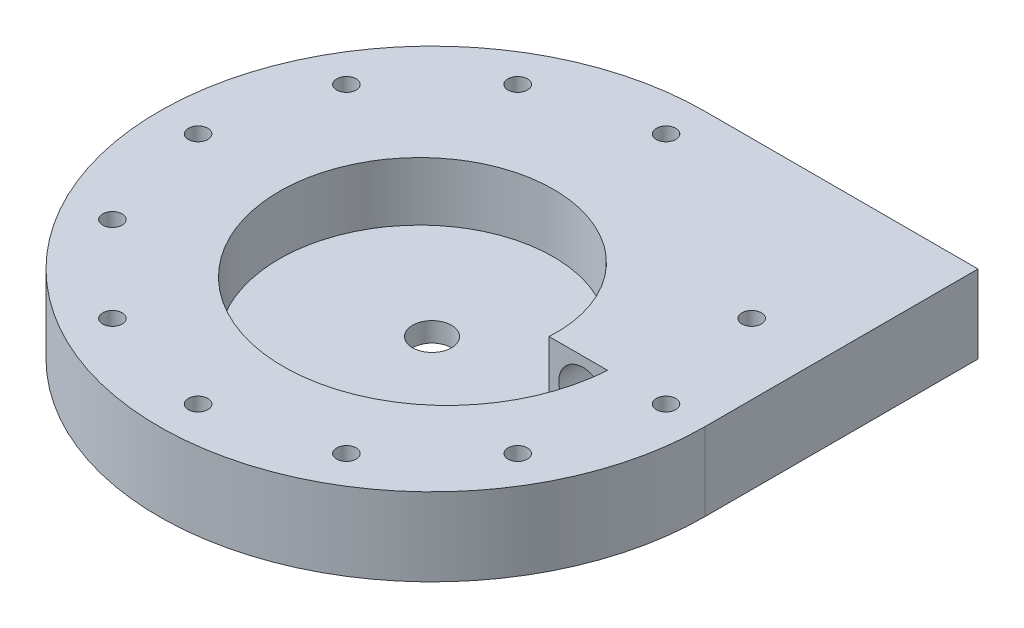
ISO-10303-21;
HEADER;
FILE_DESCRIPTION(('STEP AP214'),'2;1');
FILE_NAME('part.step','',(''),(''),'','','');
FILE_SCHEMA(('AUTOMOTIVE_DESIGN { 1 0 10303 214 1 1 1 1 }'));
ENDSEC;
DATA;
#1=APPLICATION_CONTEXT('core data for automotive mechanical design processes');
#2=APPLICATION_PROTOCOL_DEFINITION('international standard','automotive_design',2000,#1);
#3=PRODUCT_CONTEXT('',#1,'mechanical');
#4=PRODUCT('Part','Part','',(#3));
#5=PRODUCT_RELATED_PRODUCT_CATEGORY('part','',(#4));
#6=PRODUCT_DEFINITION_FORMATION('','',#4);
#7=PRODUCT_DEFINITION_CONTEXT('part definition',#1,'design');
#8=PRODUCT_DEFINITION('design','',#6,#7);
#9=PRODUCT_DEFINITION_SHAPE('','',#8);
#10=(LENGTH_UNIT() NAMED_UNIT(*) SI_UNIT(.MILLI.,.METRE.));
#11=(NAMED_UNIT(*) PLANE_ANGLE_UNIT() SI_UNIT($,.RADIAN.));
#12=(NAMED_UNIT(*) SI_UNIT($,.STERADIAN.) SOLID_ANGLE_UNIT());
#13=UNCERTAINTY_MEASURE_WITH_UNIT(LENGTH_MEASURE(1.E-05),#10,'distance_accuracy_value','');
#14=(GEOMETRIC_REPRESENTATION_CONTEXT(3) GLOBAL_UNCERTAINTY_ASSIGNED_CONTEXT((#13)) GLOBAL_UNIT_ASSIGNED_CONTEXT((#10,
#11,#12)) REPRESENTATION_CONTEXT('',''));
#15=CARTESIAN_POINT('',(0.,0.,0.));
#16=DIRECTION('',(0.,0.,1.));
#17=DIRECTION('',(1.,0.,0.));
#18=AXIS2_PLACEMENT_3D('',#15,#16,#17);
#19=CARTESIAN_POINT('',(0.,-19.05,0.));
#20=DIRECTION('',(0.,0.,1.));
#21=DIRECTION('',(1.,0.,0.));
#22=AXIS2_PLACEMENT_3D('',#19,#20,#21);
#23=PLANE('',#22);
#24=CARTESIAN_POINT('',(49.2124999999999,-11.1125,0.));
#25=DIRECTION('',(0.,0.,1.));
#26=DIRECTION('',(1.,0.,0.));
#27=AXIS2_PLACEMENT_3D('',#24,#25,#26);
#28=CIRCLE('',#27,7.9375);
#29=CARTESIAN_POINT('',(57.1499999999999,-11.1125,0.));
#30=VERTEX_POINT('',#29);
#31=CARTESIAN_POINT('',(49.2124999999999,-19.05,9.43493316167152E-13));
#32=VERTEX_POINT('',#31);
#33=EDGE_CURVE('E51',#30,#32,#28,.T.);
#34=ORIENTED_EDGE('',*,*,#33,.F.);
#35=DIRECTION('',(0.,1.,0.));
#36=VECTOR('',#35,1.);
#37=CARTESIAN_POINT('',(57.1499999999999,-19.05,1.09566965748443E-12));
#38=LINE('',#37,#36);
#39=CARTESIAN_POINT('',(57.1499999999999,0.,1.09566965748443E-12));
#40=VERTEX_POINT('',#39);
#41=EDGE_CURVE('E95',#30,#40,#38,.T.);
#42=ORIENTED_EDGE('',*,*,#41,.T.);
#43=DIRECTION('',(1.,0.,0.));
#44=VECTOR('',#43,1.);
#45=CARTESIAN_POINT('',(0.,0.,0.));
#46=LINE('',#45,#44);
#47=CARTESIAN_POINT('',(38.1,0.,0.));
#48=VERTEX_POINT('',#47);
#49=EDGE_CURVE('E59',#48,#40,#46,.T.);
#50=ORIENTED_EDGE('',*,*,#49,.F.);
#51=DIRECTION('',(0.,1.,0.));
#52=VECTOR('',#51,1.);
#53=CARTESIAN_POINT('',(38.1,-19.05,7.30446438322957E-13));
#54=LINE('',#53,#52);
#55=CARTESIAN_POINT('',(38.1,-19.05,7.30446438322957E-13));
#56=VERTEX_POINT('',#55);
#57=EDGE_CURVE('E108',#56,#48,#54,.T.);
#58=ORIENTED_EDGE('',*,*,#57,.F.);
#59=DIRECTION('',(1.,0.,0.));
#60=VECTOR('',#59,1.);
#61=CARTESIAN_POINT('',(0.,-19.05,0.));
#62=LINE('',#61,#60);
#63=EDGE_CURVE('E98',#56,#32,#62,.T.);
#64=ORIENTED_EDGE('',*,*,#63,.T.);
#65=EDGE_LOOP('',(#34,#42,#50,#58,#64));
#66=FACE_BOUND('',#65,.T.);
#67=ADVANCED_FACE('F35',(#66),#23,.T.);
#68=CARTESIAN_POINT('',(0.,-25.4,0.));
#69=DIRECTION('',(0.,1.,0.));
#70=DIRECTION('',(0.,0.,1.));
#71=AXIS2_PLACEMENT_3D('',#68,#69,#70);
#72=CYLINDRICAL_SURFACE('',#71,6.35);
#73=CARTESIAN_POINT('',(0.,-25.4,0.));
#74=DIRECTION('',(0.,1.,0.));
#75=DIRECTION('',(0.,0.,1.));
#76=AXIS2_PLACEMENT_3D('',#73,#74,#75);
#77=CIRCLE('',#76,6.35);
#78=CARTESIAN_POINT('',(0.,-25.4,6.35));
#79=VERTEX_POINT('',#78);
#80=EDGE_CURVE('E123',#79,#79,#77,.T.);
#81=ORIENTED_EDGE('',*,*,#80,.F.);
#82=EDGE_LOOP('',(#81));
#83=FACE_BOUND('',#82,.T.);
#84=CARTESIAN_POINT('',(0.,-19.05,0.));
#85=DIRECTION('',(0.,1.,0.));
#86=DIRECTION('',(0.,0.,1.));
#87=AXIS2_PLACEMENT_3D('',#84,#85,#86);
#88=CIRCLE('',#87,6.35);
#89=CARTESIAN_POINT('',(0.,-19.05,6.35));
#90=VERTEX_POINT('',#89);
#91=EDGE_CURVE('E170',#90,#90,#88,.T.);
#92=ORIENTED_EDGE('',*,*,#91,.T.);
#93=EDGE_LOOP('',(#92));
#94=FACE_BOUND('',#93,.T.);
#95=ADVANCED_FACE('F37',(#83,#94),#72,.F.);
#96=CARTESIAN_POINT('',(0.,0.,0.));
#97=DIRECTION('',(0.,1.,0.));
#98=DIRECTION('',(0.,0.,1.));
#99=AXIS2_PLACEMENT_3D('',#96,#97,#98);
#100=PLANE('',#99);
#101=CARTESIAN_POINT('',(65.9911357683747,0.,38.0999999999992));
#102=DIRECTION('',(0.,1.,0.));
#103=DIRECTION('',(0.,0.,1.));
#104=AXIS2_PLACEMENT_3D('',#101,#102,#103);
#105=CIRCLE('',#104,3.175);
#106=CARTESIAN_POINT('',(65.9911357683747,0.,41.2749999999992));
#107=VERTEX_POINT('',#106);
#108=EDGE_CURVE('E278',#107,#107,#105,.T.);
#109=ORIENTED_EDGE('',*,*,#108,.F.);
#110=EDGE_LOOP('',(#109));
#111=FACE_BOUND('',#110,.T.);
#112=CARTESIAN_POINT('',(38.1000000000008,0.,65.9911357683738));
#113=DIRECTION('',(0.,1.,0.));
#114=DIRECTION('',(0.,0.,1.));
#115=AXIS2_PLACEMENT_3D('',#112,#113,#114);
#116=CIRCLE('',#115,3.17499999999999);
#117=CARTESIAN_POINT('',(38.1000000000008,0.,69.1661357683738));
#118=VERTEX_POINT('',#117);
#119=EDGE_CURVE('E281',#118,#118,#116,.T.);
#120=ORIENTED_EDGE('',*,*,#119,.F.);
#121=EDGE_LOOP('',(#120));
#122=FACE_BOUND('',#121,.T.);
#123=CARTESIAN_POINT('',(7.9815263405954E-13,0.,76.2));
#124=DIRECTION('',(0.,1.,0.));
#125=DIRECTION('',(0.,0.,1.));
#126=AXIS2_PLACEMENT_3D('',#123,#124,#125);
#127=CIRCLE('',#126,3.17499999999999);
#128=CARTESIAN_POINT('',(7.9815263405954E-13,0.,79.375));
#129=VERTEX_POINT('',#128);
#130=EDGE_CURVE('E289',#129,#129,#127,.T.);
#131=ORIENTED_EDGE('',*,*,#130,.F.);
#132=EDGE_LOOP('',(#131));
#133=FACE_BOUND('',#132,.T.);
#134=CARTESIAN_POINT('',(-38.0999999999994,0.,65.9911357683746));
#135=DIRECTION('',(0.,1.,0.));
#136=DIRECTION('',(0.,0.,1.));
#137=AXIS2_PLACEMENT_3D('',#134,#135,#136);
#138=CIRCLE('',#137,3.17499999999999);
#139=CARTESIAN_POINT('',(-38.0999999999994,0.,69.1661357683746));
#140=VERTEX_POINT('',#139);
#141=EDGE_CURVE('E295',#140,#140,#138,.T.);
#142=ORIENTED_EDGE('',*,*,#141,.F.);
#143=EDGE_LOOP('',(#142));
#144=FACE_BOUND('',#143,.T.);
#145=CARTESIAN_POINT('',(-65.9911357683739,0.,38.1000000000005));
#146=DIRECTION('',(0.,1.,0.));
#147=DIRECTION('',(0.,0.,1.));
#148=AXIS2_PLACEMENT_3D('',#145,#146,#147);
#149=CIRCLE('',#148,3.17499999999998);
#150=CARTESIAN_POINT('',(-65.9911357683739,0.,41.2750000000005));
#151=VERTEX_POINT('',#150);
#152=EDGE_CURVE('E301',#151,#151,#149,.T.);
#153=ORIENTED_EDGE('',*,*,#152,.F.);
#154=EDGE_LOOP('',(#153));
#155=FACE_BOUND('',#154,.T.);
#156=CARTESIAN_POINT('',(-76.2,0.,0.));
#157=DIRECTION('',(0.,1.,0.));
#158=DIRECTION('',(0.,0.,1.));
#159=AXIS2_PLACEMENT_3D('',#156,#157,#158);
#160=CIRCLE('',#159,3.175);
#161=CARTESIAN_POINT('',(-76.2,0.,3.175));
#162=VERTEX_POINT('',#161);
#163=EDGE_CURVE('E307',#162,#162,#160,.T.);
#164=ORIENTED_EDGE('',*,*,#163,.F.);
#165=EDGE_LOOP('',(#164));
#166=FACE_BOUND('',#165,.T.);
#167=CARTESIAN_POINT('',(-65.9911357683744,0.,-38.0999999999996));
#168=DIRECTION('',(0.,1.,0.));
#169=DIRECTION('',(0.,0.,1.));
#170=AXIS2_PLACEMENT_3D('',#167,#168,#169);
#171=CIRCLE('',#170,3.17499999999998);
#172=CARTESIAN_POINT('',(-65.9911357683744,0.,-34.9249999999996));
#173=VERTEX_POINT('',#172);
#174=EDGE_CURVE('E313',#173,#173,#171,.T.);
#175=ORIENTED_EDGE('',*,*,#174,.F.);
#176=EDGE_LOOP('',(#175));
#177=FACE_BOUND('',#176,.T.);
#178=CARTESIAN_POINT('',(-38.1000000000003,0.,-65.9911357683741));
#179=DIRECTION('',(0.,1.,0.));
#180=DIRECTION('',(0.,0.,1.));
#181=AXIS2_PLACEMENT_3D('',#178,#179,#180);
#182=CIRCLE('',#181,3.17499999999999);
#183=CARTESIAN_POINT('',(-38.1000000000003,0.,-62.8161357683741));
#184=VERTEX_POINT('',#183);
#185=EDGE_CURVE('E160',#184,#184,#182,.T.);
#186=ORIENTED_EDGE('',*,*,#185,.F.);
#187=EDGE_LOOP('',(#186));
#188=FACE_BOUND('',#187,.T.);
#189=CARTESIAN_POINT('',(-2.66050878019847E-13,0.,-76.2));
#190=DIRECTION('',(0.,1.,0.));
#191=DIRECTION('',(0.,0.,1.));
#192=AXIS2_PLACEMENT_3D('',#189,#190,#191);
#193=CIRCLE('',#192,3.17499999999999);
#194=CARTESIAN_POINT('',(-2.66050878019847E-13,0.,-73.025));
#195=VERTEX_POINT('',#194);
#196=EDGE_CURVE('E148',#195,#195,#193,.T.);
#197=ORIENTED_EDGE('',*,*,#196,.F.);
#198=EDGE_LOOP('',(#197));
#199=FACE_BOUND('',#198,.T.);
#200=CARTESIAN_POINT('',(65.9911357683742,0.,-38.1000000000001));
#201=DIRECTION('',(0.,1.,0.));
#202=DIRECTION('',(0.,0.,1.));
#203=AXIS2_PLACEMENT_3D('',#200,#201,#202);
#204=CIRCLE('',#203,3.17499999999998);
#205=CARTESIAN_POINT('',(65.9911357683742,0.,-34.9250000000001));
#206=VERTEX_POINT('',#205);
#207=EDGE_CURVE('E147',#206,#206,#204,.T.);
#208=ORIENTED_EDGE('',*,*,#207,.F.);
#209=EDGE_LOOP('',(#208));
#210=FACE_BOUND('',#209,.T.);
#211=CARTESIAN_POINT('',(76.2,0.,0.));
#212=DIRECTION('',(0.,1.,0.));
#213=DIRECTION('',(0.,0.,1.));
#214=AXIS2_PLACEMENT_3D('',#211,#212,#213);
#215=CIRCLE('',#214,3.175);
#216=CARTESIAN_POINT('',(76.2,0.,3.175));
#217=VERTEX_POINT('',#216);
#218=EDGE_CURVE('E144',#217,#217,#215,.T.);
#219=ORIENTED_EDGE('',*,*,#218,.F.);
#220=EDGE_LOOP('',(#219));
#221=FACE_BOUND('',#220,.T.);
#222=CARTESIAN_POINT('',(0.,0.,0.));
#223=DIRECTION('',(0.,1.,0.));
#224=DIRECTION('',(0.,0.,1.));
#225=AXIS2_PLACEMENT_3D('',#222,#223,#224);
#226=CIRCLE('',#225,88.9);
#227=CARTESIAN_POINT('',(0.,0.,-88.9));
#228=VERTEX_POINT('',#227);
#229=CARTESIAN_POINT('',(88.9,0.,0.));
#230=VERTEX_POINT('',#229);
#231=EDGE_CURVE('E112',#228,#230,#226,.T.);
#232=ORIENTED_EDGE('',*,*,#231,.T.);
#233=DIRECTION('',(0.,0.,-1.));
#234=VECTOR('',#233,1.);
#235=CARTESIAN_POINT('',(88.9,0.,0.));
#236=LINE('',#235,#234);
#237=CARTESIAN_POINT('',(88.9,0.,-88.9));
#238=VERTEX_POINT('',#237);
#239=EDGE_CURVE('E114',#230,#238,#236,.T.);
#240=ORIENTED_EDGE('',*,*,#239,.T.);
#241=DIRECTION('',(-1.,0.,0.));
#242=VECTOR('',#241,1.);
#243=CARTESIAN_POINT('',(0.,0.,-88.9));
#244=LINE('',#243,#242);
#245=EDGE_CURVE('E127',#238,#228,#244,.T.);
#246=ORIENTED_EDGE('',*,*,#245,.T.);
#247=EDGE_LOOP('',(#232,#240,#246));
#248=FACE_BOUND('',#247,.T.);
#249=CARTESIAN_POINT('',(38.1,0.,0.));
#250=CARTESIAN_POINT('',(38.1041965674543,0.,-0.0650310234893211));
#251=CARTESIAN_POINT('',(38.112207842471,0.,-0.195583217435711));
#252=CARTESIAN_POINT('',(38.1261766637755,0.,-0.440876384041466));
#253=CARTESIAN_POINT('',(38.142557672689,0.,-0.771571841551634));
#254=CARTESIAN_POINT('',(38.15799051834,0.,-1.15477204735172));
#255=CARTESIAN_POINT('',(38.1712359970766,0.,-1.60960717939055));
#256=CARTESIAN_POINT('',(38.1802251596149,0.,-2.15183656026326));
#257=CARTESIAN_POINT('',(38.1801903178959,0.,-2.76477532971207));
#258=CARTESIAN_POINT('',(38.1680412903283,0.,-3.53419681611184));
#259=CARTESIAN_POINT('',(38.1336741903984,0.,-4.45549004506319));
#260=CARTESIAN_POINT('',(38.0649906075398,0.,-5.52985250203721));
#261=CARTESIAN_POINT('',(37.9473350702415,0.,-6.75402790699798));
#262=CARTESIAN_POINT('',(37.7907725442888,0.,-7.9741232433343));
#263=CARTESIAN_POINT('',(37.5955117901143,0.,-9.18845997191363));
#264=CARTESIAN_POINT('',(37.3618457740519,0.,-10.3960934142188));
#265=CARTESIAN_POINT('',(37.0900769452993,0.,-11.5956667219893));
#266=CARTESIAN_POINT('',(36.7805605683177,0.,-12.7860946187614));
#267=CARTESIAN_POINT('',(36.2602362124029,0.,-14.5561823446966));
#268=CARTESIAN_POINT('',(35.4433197108514,0.,-16.8780134918825));
#269=CARTESIAN_POINT('',(34.0888154987246,0.,-19.9822318255888));
#270=CARTESIAN_POINT('',(31.9637596052393,0.,-23.7351684115844));
#271=CARTESIAN_POINT('',(29.2450004334064,0.,-27.4747070716315));
#272=CARTESIAN_POINT('',(25.8786531238402,0.,-31.078416042582));
#273=CARTESIAN_POINT('',(22.0996835997802,0.,-34.2464633817933));
#274=CARTESIAN_POINT('',(18.4832543713797,0.,-36.5997257845931));
#275=CARTESIAN_POINT('',(14.6540630500697,0.,-38.5784658892809));
#276=CARTESIAN_POINT('',(11.2199973350229,0.,-39.9408951848067));
#277=CARTESIAN_POINT('',(8.27762034962568,0.,-40.8467003377157));
#278=CARTESIAN_POINT('',(4.6751987160475,0.,-41.6527342428785));
#279=CARTESIAN_POINT('',(1.01800901382917,0.,-42.1751682220805));
#280=CARTESIAN_POINT('',(-3.29166586790121,0.,-42.3675573323181));
#281=CARTESIAN_POINT('',(-8.20928431623215,0.,-42.016659330974));
#282=CARTESIAN_POINT('',(-14.2651349376704,0.,-40.8757997136353));
#283=CARTESIAN_POINT('',(-21.26105678275,0.,-38.4151362226922));
#284=CARTESIAN_POINT('',(-28.7662036825466,0.,-34.0526175315297));
#285=CARTESIAN_POINT('',(-35.1220185030495,0.,-28.1427581429666));
#286=CARTESIAN_POINT('',(-39.5416488760991,0.,-22.1915496852234));
#287=CARTESIAN_POINT('',(-43.0485680060908,0.,-15.6831420563096));
#288=CARTESIAN_POINT('',(-45.6523415934909,0.,-8.56474304692515));
#289=CARTESIAN_POINT('',(-47.1309614958086,0.,0.156773943034945));
#290=CARTESIAN_POINT('',(-46.6549392166821,0.,10.2288318844848));
#291=CARTESIAN_POINT('',(-44.0712713420987,0.,19.9682335628512));
#292=CARTESIAN_POINT('',(-39.6379258150104,0.,28.827244651305));
#293=CARTESIAN_POINT('',(-33.518294108672,0.,36.6151592087923));
#294=CARTESIAN_POINT('',(-25.9784378571935,0.,43.0353446714083));
#295=CARTESIAN_POINT('',(-17.3297822785468,0.,47.8557822011461));
#296=CARTESIAN_POINT('',(-7.91427363690238,0.,50.9140631801448));
#297=CARTESIAN_POINT('',(1.91031810746671,0.,52.1192077604666));
#298=CARTESIAN_POINT('',(10.5502240550294,0.,51.534251171655));
#299=CARTESIAN_POINT('',(17.769170060638,0.,49.8908635908192));
#300=CARTESIAN_POINT('',(23.5587832146421,0.,47.7937360693553));
#301=CARTESIAN_POINT('',(28.0160936058454,0.,45.6963395690024));
#302=CARTESIAN_POINT('',(32.2624219932805,0.,43.1994623885599));
#303=CARTESIAN_POINT('',(36.2636376989664,0.,40.3262584001815));
#304=CARTESIAN_POINT('',(39.9881958815629,0.,37.1026212377994));
#305=CARTESIAN_POINT('',(43.4073902730877,0.,33.5568376399754));
#306=CARTESIAN_POINT('',(46.8814700527218,0.,29.2396344341217));
#307=CARTESIAN_POINT('',(50.2256241460843,0.,24.0642771872592));
#308=CARTESIAN_POINT('',(52.9395445383652,0.,18.5266700860482));
#309=CARTESIAN_POINT('',(54.9867334003754,0.,12.7153792260621));
#310=CARTESIAN_POINT('',(56.0713738347849,0.,8.22705753545142));
#311=CARTESIAN_POINT('',(56.5719477123072,0.,5.34790230885148));
#312=CARTESIAN_POINT('',(56.8158291905139,0.,3.51933175225633));
#313=CARTESIAN_POINT('',(56.9064899864385,0.,2.75598725271143));
#314=CARTESIAN_POINT('',(56.9641454106768,0.,2.22175243273946));
#315=CARTESIAN_POINT('',(57.0096714796792,0.,1.75997476740017));
#316=CARTESIAN_POINT('',(57.0444618140415,0.,1.38116298397712));
#317=CARTESIAN_POINT('',(57.0704962533167,0.,1.08031026974818));
#318=CARTESIAN_POINT('',(57.1016943193933,0.,0.693015395252636));
#319=CARTESIAN_POINT('',(57.128353891131,0.,0.322618205026421));
#320=CARTESIAN_POINT('',(57.1416068547885,0.,0.130062206633276));
#321=CARTESIAN_POINT('',(57.1499999999999,0.,1.68608907932363E-13));
#322=B_SPLINE_CURVE_WITH_KNOTS('',4,(#249,#250,#251,#252,#253,#254,#255,#256,#257,#258,#259,
#260,#261,#262,#263,#264,#265,#266,#267,#268,#269,#270,#271,#272,#273,#274,#275,#276,#277,#278,
#279,#280,#281,#282,#283,#284,#285,#286,#287,#288,#289,#290,#291,#292,#293,#294,#295,#296,#297,
#298,#299,#300,#301,#302,#303,#304,#305,#306,#307,#308,#309,#310,#311,#312,#313,#314,#315,#316,
#317,#318,#319,#320,#321),.UNSPECIFIED.,.F.,.F.,(5,1,1,1,1,1,1,1,1,1,1,1,1,1,1,1,1,1,1,1,1,1,1,
1,1,1,1,1,1,1,1,1,1,1,1,1,1,1,1,1,1,1,1,1,1,1,1,1,1,1,1,1,1,1,1,1,1,1,1,1,1,1,1,1,1,1,1,1,1,5),
(0.0673785416487452,0.0682597118521968,0.0691408820556485,0.0700220522591002,0.0709032224625518,
0.0726655628694552,0.0744279032763585,0.0761902436832619,0.0779525840901652,0.0814772649039719,
0.0850019457177785,0.0885266265315852,0.0920513073453919,0.0955759881591985,0.09910067381429,
0.102625359469381,0.106150045124473,0.109674730779564,0.120248787744839,0.130822842883291,
0.144921581850013,0.159020327622357,0.173119080200323,0.187217836499478,0.201316596519822,
0.208365976529993,0.22246473057365,0.229514107595478,0.236563484617306,0.250662246014213,
0.264761007411121,0.278859755742536,0.292958504073951,0.321155989829039,0.349353478989294,
0.377550965629463,0.391649727584961,0.405748489540459,0.433946008799206,0.46405679877138,
0.492254247443628,0.520451696115876,0.548649172618596,0.576846649121315,0.605044111074072,
0.633241573026829,0.66143903402512,0.689636495023411,0.717833968261123,0.731932704879979,
0.746031441498835,0.760130178793945,0.774228916089054,0.788327653384163,0.802426390679273,
0.816525135501603,0.830623880323933,0.851771997557428,0.87292011053036,0.887018851092126,
0.901117591653892,0.904642276794333,0.906404619364554,0.908166961934775,0.909929304504996,
0.910810475790106,0.911691647075217,0.912572818360327,0.913453989645437,0.915216332215658),.UNSPECIFIED.);
#323=EDGE_CURVE('E107',#48,#40,#322,.T.);
#324=ORIENTED_EDGE('',*,*,#323,.F.);
#325=ORIENTED_EDGE('',*,*,#49,.T.);
#326=EDGE_LOOP('',(#324,#325));
#327=FACE_BOUND('',#326,.T.);
#328=ADVANCED_FACE('F193',(#111,#122,#133,#144,#155,#166,#177,#188,#199,#210,#221,#248,#327),
#100,.T.);
#329=CARTESIAN_POINT('',(0.,-25.4,0.));
#330=DIRECTION('',(0.,1.,0.));
#331=DIRECTION('',(0.,0.,1.));
#332=AXIS2_PLACEMENT_3D('',#329,#330,#331);
#333=CYLINDRICAL_SURFACE('',#332,88.9);
#334=ORIENTED_EDGE('',*,*,#231,.F.);
#335=DIRECTION('',(0.,1.,0.));
#336=VECTOR('',#335,1.);
#337=CARTESIAN_POINT('',(0.,-25.4,-88.9));
#338=LINE('',#337,#336);
#339=CARTESIAN_POINT('',(0.,-25.4,-88.9));
#340=VERTEX_POINT('',#339);
#341=EDGE_CURVE('E11',#340,#228,#338,.T.);
#342=ORIENTED_EDGE('',*,*,#341,.F.);
#343=CARTESIAN_POINT('',(0.,-25.4,0.));
#344=DIRECTION('',(0.,1.,0.));
#345=DIRECTION('',(0.,0.,1.));
#346=AXIS2_PLACEMENT_3D('',#343,#344,#345);
#347=CIRCLE('',#346,88.9);
#348=CARTESIAN_POINT('',(88.9,-25.4,0.));
#349=VERTEX_POINT('',#348);
#350=EDGE_CURVE('E126',#340,#349,#347,.T.);
#351=ORIENTED_EDGE('',*,*,#350,.T.);
#352=DIRECTION('',(0.,1.,0.));
#353=VECTOR('',#352,1.);
#354=CARTESIAN_POINT('',(88.9,-25.4,0.));
#355=LINE('',#354,#353);
#356=EDGE_CURVE('E135',#349,#230,#355,.T.);
#357=ORIENTED_EDGE('',*,*,#356,.T.);
#358=EDGE_LOOP('',(#334,#342,#351,#357));
#359=FACE_BOUND('',#358,.T.);
#360=ADVANCED_FACE('F196',(#359),#333,.T.);
#361=CARTESIAN_POINT('',(0.,-25.4,-88.9));
#362=DIRECTION('',(0.,0.,-1.));
#363=DIRECTION('',(-1.,0.,0.));
#364=AXIS2_PLACEMENT_3D('',#361,#362,#363);
#365=PLANE('',#364);
#366=CARTESIAN_POINT('',(49.2124999999999,-11.1125,-88.9));
#367=DIRECTION('',(0.,0.,1.));
#368=DIRECTION('',(1.,0.,0.));
#369=AXIS2_PLACEMENT_3D('',#366,#367,#368);
#370=CIRCLE('',#369,7.9375);
#371=CARTESIAN_POINT('',(57.1499999999999,-11.1125,-88.9));
#372=VERTEX_POINT('',#371);
#373=EDGE_CURVE('E99',#372,#372,#370,.T.);
#374=ORIENTED_EDGE('',*,*,#373,.T.);
#375=EDGE_LOOP('',(#374));
#376=FACE_BOUND('',#375,.T.);
#377=ORIENTED_EDGE('',*,*,#245,.F.);
#378=DIRECTION('',(0.,1.,0.));
#379=VECTOR('',#378,1.);
#380=CARTESIAN_POINT('',(88.9,-25.4,-88.9));
#381=LINE('',#380,#379);
#382=CARTESIAN_POINT('',(88.9,-25.4,-88.9));
#383=VERTEX_POINT('',#382);
#384=EDGE_CURVE('E44',#383,#238,#381,.T.);
#385=ORIENTED_EDGE('',*,*,#384,.F.);
#386=DIRECTION('',(-1.,0.,0.));
#387=VECTOR('',#386,1.);
#388=CARTESIAN_POINT('',(0.,-25.4,-88.9));
#389=LINE('',#388,#387);
#390=EDGE_CURVE('E133',#383,#340,#389,.T.);
#391=ORIENTED_EDGE('',*,*,#390,.T.);
#392=ORIENTED_EDGE('',*,*,#341,.T.);
#393=EDGE_LOOP('',(#377,#385,#391,#392));
#394=FACE_BOUND('',#393,.T.);
#395=ADVANCED_FACE('F198',(#376,#394),#365,.T.);
#396=CARTESIAN_POINT('',(88.9,-25.4,0.));
#397=DIRECTION('',(1.,0.,0.));
#398=DIRECTION('',(0.,0.,-1.));
#399=AXIS2_PLACEMENT_3D('',#396,#397,#398);
#400=PLANE('',#399);
#401=ORIENTED_EDGE('',*,*,#239,.F.);
#402=ORIENTED_EDGE('',*,*,#356,.F.);
#403=DIRECTION('',(0.,0.,-1.));
#404=VECTOR('',#403,1.);
#405=CARTESIAN_POINT('',(88.9,-25.4,0.));
#406=LINE('',#405,#404);
#407=EDGE_CURVE('E130',#349,#383,#406,.T.);
#408=ORIENTED_EDGE('',*,*,#407,.T.);
#409=ORIENTED_EDGE('',*,*,#384,.T.);
#410=EDGE_LOOP('',(#401,#402,#408,#409));
#411=FACE_BOUND('',#410,.T.);
#412=ADVANCED_FACE('F191',(#411),#400,.T.);
#413=CARTESIAN_POINT('',(0.,-25.4,0.));
#414=DIRECTION('',(0.,1.,0.));
#415=DIRECTION('',(0.,0.,1.));
#416=AXIS2_PLACEMENT_3D('',#413,#414,#415);
#417=PLANE('',#416);
#418=CARTESIAN_POINT('',(65.9911357683747,-25.4,38.0999999999992));
#419=DIRECTION('',(0.,1.,0.));
#420=DIRECTION('',(0.,0.,1.));
#421=AXIS2_PLACEMENT_3D('',#418,#419,#420);
#422=CIRCLE('',#421,3.17499999999999);
#423=CARTESIAN_POINT('',(65.9911357683747,-25.4,41.2749999999991));
#424=VERTEX_POINT('',#423);
#425=EDGE_CURVE('E39',#424,#424,#422,.T.);
#426=ORIENTED_EDGE('',*,*,#425,.T.);
#427=EDGE_LOOP('',(#426));
#428=FACE_BOUND('',#427,.T.);
#429=CARTESIAN_POINT('',(38.1000000000008,-25.4,65.9911357683738));
#430=DIRECTION('',(0.,1.,0.));
#431=DIRECTION('',(0.,0.,1.));
#432=AXIS2_PLACEMENT_3D('',#429,#430,#431);
#433=CIRCLE('',#432,3.17499999999999);
#434=CARTESIAN_POINT('',(38.1000000000008,-25.4,69.1661357683738));
#435=VERTEX_POINT('',#434);
#436=EDGE_CURVE('E283',#435,#435,#433,.T.);
#437=ORIENTED_EDGE('',*,*,#436,.T.);
#438=EDGE_LOOP('',(#437));
#439=FACE_BOUND('',#438,.T.);
#440=CARTESIAN_POINT('',(7.9815263405954E-13,-25.4,76.2));
#441=DIRECTION('',(0.,1.,0.));
#442=DIRECTION('',(0.,0.,1.));
#443=AXIS2_PLACEMENT_3D('',#440,#441,#442);
#444=CIRCLE('',#443,3.17499999999999);
#445=CARTESIAN_POINT('',(7.9815263405954E-13,-25.4,79.375));
#446=VERTEX_POINT('',#445);
#447=EDGE_CURVE('E292',#446,#446,#444,.T.);
#448=ORIENTED_EDGE('',*,*,#447,.T.);
#449=EDGE_LOOP('',(#448));
#450=FACE_BOUND('',#449,.T.);
#451=CARTESIAN_POINT('',(-38.0999999999994,-25.4,65.9911357683746));
#452=DIRECTION('',(0.,1.,0.));
#453=DIRECTION('',(0.,0.,1.));
#454=AXIS2_PLACEMENT_3D('',#451,#452,#453);
#455=CIRCLE('',#454,3.17499999999999);
#456=CARTESIAN_POINT('',(-38.0999999999994,-25.4,69.1661357683746));
#457=VERTEX_POINT('',#456);
#458=EDGE_CURVE('E298',#457,#457,#455,.T.);
#459=ORIENTED_EDGE('',*,*,#458,.T.);
#460=EDGE_LOOP('',(#459));
#461=FACE_BOUND('',#460,.T.);
#462=CARTESIAN_POINT('',(-65.9911357683739,-25.4,38.1000000000005));
#463=DIRECTION('',(0.,1.,0.));
#464=DIRECTION('',(0.,0.,1.));
#465=AXIS2_PLACEMENT_3D('',#462,#463,#464);
#466=CIRCLE('',#465,3.17499999999998);
#467=CARTESIAN_POINT('',(-65.9911357683739,-25.4,41.2750000000005));
#468=VERTEX_POINT('',#467);
#469=EDGE_CURVE('E304',#468,#468,#466,.T.);
#470=ORIENTED_EDGE('',*,*,#469,.T.);
#471=EDGE_LOOP('',(#470));
#472=FACE_BOUND('',#471,.T.);
#473=CARTESIAN_POINT('',(-76.2,-25.4,0.));
#474=DIRECTION('',(0.,1.,0.));
#475=DIRECTION('',(0.,0.,1.));
#476=AXIS2_PLACEMENT_3D('',#473,#474,#475);
#477=CIRCLE('',#476,3.17499999999999);
#478=CARTESIAN_POINT('',(-76.2,-25.4,3.17499999999999));
#479=VERTEX_POINT('',#478);
#480=EDGE_CURVE('E310',#479,#479,#477,.T.);
#481=ORIENTED_EDGE('',*,*,#480,.T.);
#482=EDGE_LOOP('',(#481));
#483=FACE_BOUND('',#482,.T.);
#484=CARTESIAN_POINT('',(-65.9911357683744,-25.4,-38.0999999999996));
#485=DIRECTION('',(0.,1.,0.));
#486=DIRECTION('',(0.,0.,1.));
#487=AXIS2_PLACEMENT_3D('',#484,#485,#486);
#488=CIRCLE('',#487,3.17499999999998);
#489=CARTESIAN_POINT('',(-65.9911357683744,-25.4,-34.9249999999996));
#490=VERTEX_POINT('',#489);
#491=EDGE_CURVE('E316',#490,#490,#488,.T.);
#492=ORIENTED_EDGE('',*,*,#491,.T.);
#493=EDGE_LOOP('',(#492));
#494=FACE_BOUND('',#493,.T.);
#495=CARTESIAN_POINT('',(-38.1000000000003,-25.4,-65.9911357683741));
#496=DIRECTION('',(0.,1.,0.));
#497=DIRECTION('',(0.,0.,1.));
#498=AXIS2_PLACEMENT_3D('',#495,#496,#497);
#499=CIRCLE('',#498,3.17499999999999);
#500=CARTESIAN_POINT('',(-38.1000000000003,-25.4,-62.8161357683741));
#501=VERTEX_POINT('',#500);
#502=EDGE_CURVE('E155',#501,#501,#499,.T.);
#503=ORIENTED_EDGE('',*,*,#502,.T.);
#504=EDGE_LOOP('',(#503));
#505=FACE_BOUND('',#504,.T.);
#506=CARTESIAN_POINT('',(-2.66050878019847E-13,-25.4,-76.2));
#507=DIRECTION('',(0.,1.,0.));
#508=DIRECTION('',(0.,0.,1.));
#509=AXIS2_PLACEMENT_3D('',#506,#507,#508);
#510=CIRCLE('',#509,3.17499999999999);
#511=CARTESIAN_POINT('',(-2.66050878019847E-13,-25.4,-73.025));
#512=VERTEX_POINT('',#511);
#513=EDGE_CURVE('E145',#512,#512,#510,.T.);
#514=ORIENTED_EDGE('',*,*,#513,.T.);
#515=EDGE_LOOP('',(#514));
#516=FACE_BOUND('',#515,.T.);
#517=CARTESIAN_POINT('',(65.9911357683742,-25.4,-38.1000000000001));
#518=DIRECTION('',(0.,1.,0.));
#519=DIRECTION('',(0.,0.,1.));
#520=AXIS2_PLACEMENT_3D('',#517,#518,#519);
#521=CIRCLE('',#520,3.17499999999998);
#522=CARTESIAN_POINT('',(65.9911357683742,-25.4,-34.9250000000001));
#523=VERTEX_POINT('',#522);
#524=EDGE_CURVE('E152',#523,#523,#521,.T.);
#525=ORIENTED_EDGE('',*,*,#524,.T.);
#526=EDGE_LOOP('',(#525));
#527=FACE_BOUND('',#526,.T.);
#528=CARTESIAN_POINT('',(76.2,-25.4,0.));
#529=DIRECTION('',(0.,1.,0.));
#530=DIRECTION('',(0.,0.,1.));
#531=AXIS2_PLACEMENT_3D('',#528,#529,#530);
#532=CIRCLE('',#531,3.17499999999999);
#533=CARTESIAN_POINT('',(76.2,-25.4,3.17499999999999));
#534=VERTEX_POINT('',#533);
#535=EDGE_CURVE('E91',#534,#534,#532,.T.);
#536=ORIENTED_EDGE('',*,*,#535,.T.);
#537=EDGE_LOOP('',(#536));
#538=FACE_BOUND('',#537,.T.);
#539=ORIENTED_EDGE('',*,*,#80,.T.);
#540=EDGE_LOOP('',(#539));
#541=FACE_BOUND('',#540,.T.);
#542=ORIENTED_EDGE('',*,*,#350,.F.);
#543=ORIENTED_EDGE('',*,*,#390,.F.);
#544=ORIENTED_EDGE('',*,*,#407,.F.);
#545=EDGE_LOOP('',(#542,#543,#544));
#546=FACE_BOUND('',#545,.T.);
#547=ADVANCED_FACE('F188',(#428,#439,#450,#461,#472,#483,#494,#505,#516,#527,#538,#541,#546),
#417,.F.);
#548=EDGE_CURVE('E86',#32,#30,#28,.T.);
#549=ORIENTED_EDGE('',*,*,#548,.F.);
#550=CARTESIAN_POINT('',(57.1499999999999,-19.05,1.09566965748443E-12));
#551=VERTEX_POINT('',#550);
#552=EDGE_CURVE('E111',#32,#551,#62,.T.);
#553=ORIENTED_EDGE('',*,*,#552,.T.);
#554=EDGE_CURVE('E104',#551,#30,#38,.T.);
#555=ORIENTED_EDGE('',*,*,#554,.T.);
#556=EDGE_LOOP('',(#549,#553,#555));
#557=FACE_BOUND('',#556,.T.);
#558=ADVANCED_FACE('F110',(#557),#23,.T.);
#559=CARTESIAN_POINT('',(38.1,-19.05,0.));
#560=CARTESIAN_POINT('',(38.1041965674543,-19.05,-0.0650310234893211));
#561=CARTESIAN_POINT('',(38.112207842471,-19.05,-0.195583217435711));
#562=CARTESIAN_POINT('',(38.1261766637755,-19.05,-0.440876384041466));
#563=CARTESIAN_POINT('',(38.142557672689,-19.05,-0.771571841551634));
#564=CARTESIAN_POINT('',(38.15799051834,-19.05,-1.15477204735172));
#565=CARTESIAN_POINT('',(38.1712359970766,-19.05,-1.60960717939055));
#566=CARTESIAN_POINT('',(38.1802251596149,-19.05,-2.15183656026326));
#567=CARTESIAN_POINT('',(38.1801903178959,-19.05,-2.76477532971207));
#568=CARTESIAN_POINT('',(38.1680412903283,-19.05,-3.53419681611184));
#569=CARTESIAN_POINT('',(38.1336741903984,-19.05,-4.45549004506319));
#570=CARTESIAN_POINT('',(38.0649906075398,-19.05,-5.52985250203721));
#571=CARTESIAN_POINT('',(37.9473350702415,-19.05,-6.75402790699798));
#572=CARTESIAN_POINT('',(37.7907725442888,-19.05,-7.9741232433343));
#573=CARTESIAN_POINT('',(37.5955117901143,-19.05,-9.18845997191363));
#574=CARTESIAN_POINT('',(37.3618457740519,-19.05,-10.3960934142188));
#575=CARTESIAN_POINT('',(37.0900769452993,-19.05,-11.5956667219893));
#576=CARTESIAN_POINT('',(36.7805605683177,-19.05,-12.7860946187614));
#577=CARTESIAN_POINT('',(36.2602362124029,-19.05,-14.5561823446966));
#578=CARTESIAN_POINT('',(35.4433197108514,-19.05,-16.8780134918825));
#579=CARTESIAN_POINT('',(34.0888154987246,-19.05,-19.9822318255888));
#580=CARTESIAN_POINT('',(31.9637596052393,-19.05,-23.7351684115844));
#581=CARTESIAN_POINT('',(29.2450004334064,-19.05,-27.4747070716315));
#582=CARTESIAN_POINT('',(25.8786531238402,-19.05,-31.078416042582));
#583=CARTESIAN_POINT('',(22.0996835997802,-19.05,-34.2464633817933));
#584=CARTESIAN_POINT('',(18.4832543713797,-19.05,-36.5997257845931));
#585=CARTESIAN_POINT('',(14.6540630500697,-19.05,-38.5784658892809));
#586=CARTESIAN_POINT('',(11.2199973350229,-19.05,-39.9408951848067));
#587=CARTESIAN_POINT('',(8.27762034962568,-19.05,-40.8467003377157));
#588=CARTESIAN_POINT('',(4.6751987160475,-19.05,-41.6527342428785));
#589=CARTESIAN_POINT('',(1.01800901382917,-19.05,-42.1751682220805));
#590=CARTESIAN_POINT('',(-3.29166586790121,-19.05,-42.3675573323181));
#591=CARTESIAN_POINT('',(-8.20928431623215,-19.05,-42.016659330974));
#592=CARTESIAN_POINT('',(-14.2651349376704,-19.05,-40.8757997136353));
#593=CARTESIAN_POINT('',(-21.26105678275,-19.05,-38.4151362226922));
#594=CARTESIAN_POINT('',(-28.7662036825466,-19.05,-34.0526175315297));
#595=CARTESIAN_POINT('',(-35.1220185030495,-19.05,-28.1427581429666));
#596=CARTESIAN_POINT('',(-39.5416488760991,-19.05,-22.1915496852234));
#597=CARTESIAN_POINT('',(-43.0485680060908,-19.05,-15.6831420563096));
#598=CARTESIAN_POINT('',(-45.6523415934909,-19.05,-8.56474304692515));
#599=CARTESIAN_POINT('',(-47.1309614958086,-19.05,0.156773943034945));
#600=CARTESIAN_POINT('',(-46.6549392166821,-19.05,10.2288318844848));
#601=CARTESIAN_POINT('',(-44.0712713420987,-19.05,19.9682335628512));
#602=CARTESIAN_POINT('',(-39.6379258150104,-19.05,28.827244651305));
#603=CARTESIAN_POINT('',(-33.518294108672,-19.05,36.6151592087923));
#604=CARTESIAN_POINT('',(-25.9784378571935,-19.05,43.0353446714083));
#605=CARTESIAN_POINT('',(-17.3297822785468,-19.05,47.8557822011461));
#606=CARTESIAN_POINT('',(-7.91427363690238,-19.05,50.9140631801448));
#607=CARTESIAN_POINT('',(1.91031810746671,-19.05,52.1192077604666));
#608=CARTESIAN_POINT('',(10.5502240550294,-19.05,51.534251171655));
#609=CARTESIAN_POINT('',(17.769170060638,-19.05,49.8908635908192));
#610=CARTESIAN_POINT('',(23.5587832146421,-19.05,47.7937360693553));
#611=CARTESIAN_POINT('',(28.0160936058454,-19.05,45.6963395690024));
#612=CARTESIAN_POINT('',(32.2624219932805,-19.05,43.1994623885599));
#613=CARTESIAN_POINT('',(36.2636376989664,-19.05,40.3262584001815));
#614=CARTESIAN_POINT('',(39.9881958815629,-19.05,37.1026212377994));
#615=CARTESIAN_POINT('',(43.4073902730877,-19.05,33.5568376399754));
#616=CARTESIAN_POINT('',(46.8814700527218,-19.05,29.2396344341217));
#617=CARTESIAN_POINT('',(50.2256241460843,-19.05,24.0642771872592));
#618=CARTESIAN_POINT('',(52.9395445383652,-19.05,18.5266700860482));
#619=CARTESIAN_POINT('',(54.9867334003754,-19.05,12.7153792260621));
#620=CARTESIAN_POINT('',(56.0713738347849,-19.05,8.22705753545142));
#621=CARTESIAN_POINT('',(56.5719477123072,-19.05,5.34790230885148));
#622=CARTESIAN_POINT('',(56.8158291905139,-19.05,3.51933175225633));
#623=CARTESIAN_POINT('',(56.9064899864385,-19.05,2.75598725271143));
#624=CARTESIAN_POINT('',(56.9641454106768,-19.05,2.22175243273946));
#625=CARTESIAN_POINT('',(57.0096714796792,-19.05,1.75997476740017));
#626=CARTESIAN_POINT('',(57.0444618140415,-19.05,1.38116298397712));
#627=CARTESIAN_POINT('',(57.0704962533167,-19.05,1.08031026974818));
#628=CARTESIAN_POINT('',(57.1016943193933,-19.05,0.693015395252636));
#629=CARTESIAN_POINT('',(57.128353891131,-19.05,0.322618205026421));
#630=CARTESIAN_POINT('',(57.1416068547885,-19.05,0.130062206633276));
#631=CARTESIAN_POINT('',(57.1499999999999,-19.05,1.68608907932363E-13));
#632=B_SPLINE_CURVE_WITH_KNOTS('',4,(#559,#560,#561,#562,#563,#564,#565,#566,#567,#568,#569,
#570,#571,#572,#573,#574,#575,#576,#577,#578,#579,#580,#581,#582,#583,#584,#585,#586,#587,#588,
#589,#590,#591,#592,#593,#594,#595,#596,#597,#598,#599,#600,#601,#602,#603,#604,#605,#606,#607,
#608,#609,#610,#611,#612,#613,#614,#615,#616,#617,#618,#619,#620,#621,#622,#623,#624,#625,#626,
#627,#628,#629,#630,#631),.UNSPECIFIED.,.F.,.F.,(5,1,1,1,1,1,1,1,1,1,1,1,1,1,1,1,1,1,1,1,1,1,1,
1,1,1,1,1,1,1,1,1,1,1,1,1,1,1,1,1,1,1,1,1,1,1,1,1,1,1,1,1,1,1,1,1,1,1,1,1,1,1,1,1,1,1,1,1,1,5),
(0.0673785416487452,0.0682597118521968,0.0691408820556485,0.0700220522591002,0.0709032224625518,
0.0726655628694552,0.0744279032763585,0.0761902436832619,0.0779525840901652,0.0814772649039719,
0.0850019457177785,0.0885266265315852,0.0920513073453919,0.0955759881591985,0.09910067381429,
0.102625359469381,0.106150045124473,0.109674730779564,0.120248787744839,0.130822842883291,
0.144921581850013,0.159020327622357,0.173119080200323,0.187217836499478,0.201316596519822,
0.208365976529993,0.22246473057365,0.229514107595478,0.236563484617306,0.250662246014213,
0.264761007411121,0.278859755742536,0.292958504073951,0.321155989829039,0.349353478989294,
0.377550965629463,0.391649727584961,0.405748489540459,0.433946008799206,0.46405679877138,
0.492254247443628,0.520451696115876,0.548649172618596,0.576846649121315,0.605044111074072,
0.633241573026829,0.66143903402512,0.689636495023411,0.717833968261123,0.731932704879979,
0.746031441498835,0.760130178793945,0.774228916089054,0.788327653384163,0.802426390679273,
0.816525135501603,0.830623880323933,0.851771997557428,0.87292011053036,0.887018851092126,
0.901117591653892,0.904642276794333,0.906404619364554,0.908166961934775,0.909929304504996,
0.910810475790106,0.911691647075217,0.912572818360327,0.913453989645437,0.915216332215658),.UNSPECIFIED.);
#633=DIRECTION('',(0.,1.,0.));
#634=VECTOR('',#633,1.);
#635=SURFACE_OF_LINEAR_EXTRUSION('',#632,#634);
#636=ORIENTED_EDGE('',*,*,#323,.T.);
#637=ORIENTED_EDGE('',*,*,#41,.F.);
#638=ORIENTED_EDGE('',*,*,#554,.F.);
#639=EDGE_CURVE('E122',#56,#551,#632,.T.);
#640=ORIENTED_EDGE('',*,*,#639,.F.);
#641=ORIENTED_EDGE('',*,*,#57,.T.);
#642=EDGE_LOOP('',(#636,#637,#638,#640,#641));
#643=FACE_BOUND('',#642,.T.);
#644=ADVANCED_FACE('F102',(#643),#635,.F.);
#645=CARTESIAN_POINT('',(0.,-19.05,0.));
#646=DIRECTION('',(0.,1.,0.));
#647=DIRECTION('',(0.,0.,1.));
#648=AXIS2_PLACEMENT_3D('',#645,#646,#647);
#649=PLANE('',#648);
#650=ORIENTED_EDGE('',*,*,#91,.F.);
#651=EDGE_LOOP('',(#650));
#652=FACE_BOUND('',#651,.T.);
#653=ORIENTED_EDGE('',*,*,#63,.F.);
#654=ORIENTED_EDGE('',*,*,#639,.T.);
#655=ORIENTED_EDGE('',*,*,#552,.F.);
#656=EDGE_LOOP('',(#653,#654,#655));
#657=FACE_BOUND('',#656,.T.);
#658=ADVANCED_FACE('F184',(#652,#657),#649,.T.);
#659=CARTESIAN_POINT('',(49.2124999999999,-11.1125,-88.9));
#660=DIRECTION('',(0.,0.,1.));
#661=DIRECTION('',(1.,0.,0.));
#662=AXIS2_PLACEMENT_3D('',#659,#660,#661);
#663=CYLINDRICAL_SURFACE('',#662,7.9375);
#664=ORIENTED_EDGE('',*,*,#373,.F.);
#665=EDGE_LOOP('',(#664));
#666=FACE_BOUND('',#665,.T.);
#667=ORIENTED_EDGE('',*,*,#33,.T.);
#668=ORIENTED_EDGE('',*,*,#548,.T.);
#669=EDGE_LOOP('',(#667,#668));
#670=FACE_BOUND('',#669,.T.);
#671=ADVANCED_FACE('F87',(#666,#670),#663,.F.);
#672=CARTESIAN_POINT('',(76.2,0.,0.));
#673=DIRECTION('',(0.,1.,0.));
#674=DIRECTION('',(0.,0.,1.));
#675=AXIS2_PLACEMENT_3D('',#672,#673,#674);
#676=CYLINDRICAL_SURFACE('',#675,3.17499999999999);
#677=ORIENTED_EDGE('',*,*,#218,.T.);
#678=EDGE_LOOP('',(#677));
#679=FACE_BOUND('',#678,.T.);
#680=ORIENTED_EDGE('',*,*,#535,.F.);
#681=EDGE_LOOP('',(#680));
#682=FACE_BOUND('',#681,.T.);
#683=ADVANCED_FACE('F226',(#679,#682),#676,.F.);
#684=CARTESIAN_POINT('',(65.9911357683742,0.,-38.1000000000001));
#685=DIRECTION('',(0.,1.,0.));
#686=DIRECTION('',(0.,0.,1.));
#687=AXIS2_PLACEMENT_3D('',#684,#685,#686);
#688=CYLINDRICAL_SURFACE('',#687,3.17499999999998);
#689=ORIENTED_EDGE('',*,*,#207,.T.);
#690=EDGE_LOOP('',(#689));
#691=FACE_BOUND('',#690,.T.);
#692=ORIENTED_EDGE('',*,*,#524,.F.);
#693=EDGE_LOOP('',(#692));
#694=FACE_BOUND('',#693,.T.);
#695=ADVANCED_FACE('F231',(#691,#694),#688,.F.);
#696=CARTESIAN_POINT('',(-2.66050878019847E-13,0.,-76.2));
#697=DIRECTION('',(0.,1.,0.));
#698=DIRECTION('',(0.,0.,1.));
#699=AXIS2_PLACEMENT_3D('',#696,#697,#698);
#700=CYLINDRICAL_SURFACE('',#699,3.17499999999999);
#701=ORIENTED_EDGE('',*,*,#196,.T.);
#702=EDGE_LOOP('',(#701));
#703=FACE_BOUND('',#702,.T.);
#704=ORIENTED_EDGE('',*,*,#513,.F.);
#705=EDGE_LOOP('',(#704));
#706=FACE_BOUND('',#705,.T.);
#707=ADVANCED_FACE('F238',(#703,#706),#700,.F.);
#708=CARTESIAN_POINT('',(-38.1000000000003,0.,-65.9911357683741));
#709=DIRECTION('',(0.,1.,0.));
#710=DIRECTION('',(0.,0.,1.));
#711=AXIS2_PLACEMENT_3D('',#708,#709,#710);
#712=CYLINDRICAL_SURFACE('',#711,3.17499999999999);
#713=ORIENTED_EDGE('',*,*,#185,.T.);
#714=EDGE_LOOP('',(#713));
#715=FACE_BOUND('',#714,.T.);
#716=ORIENTED_EDGE('',*,*,#502,.F.);
#717=EDGE_LOOP('',(#716));
#718=FACE_BOUND('',#717,.T.);
#719=ADVANCED_FACE('F242',(#715,#718),#712,.F.);
#720=CARTESIAN_POINT('',(-65.9911357683744,0.,-38.0999999999996));
#721=DIRECTION('',(0.,1.,0.));
#722=DIRECTION('',(0.,0.,1.));
#723=AXIS2_PLACEMENT_3D('',#720,#721,#722);
#724=CYLINDRICAL_SURFACE('',#723,3.17499999999998);
#725=ORIENTED_EDGE('',*,*,#174,.T.);
#726=EDGE_LOOP('',(#725));
#727=FACE_BOUND('',#726,.T.);
#728=ORIENTED_EDGE('',*,*,#491,.F.);
#729=EDGE_LOOP('',(#728));
#730=FACE_BOUND('',#729,.T.);
#731=ADVANCED_FACE('F245',(#727,#730),#724,.F.);
#732=CARTESIAN_POINT('',(-76.2,0.,0.));
#733=DIRECTION('',(0.,1.,0.));
#734=DIRECTION('',(0.,0.,1.));
#735=AXIS2_PLACEMENT_3D('',#732,#733,#734);
#736=CYLINDRICAL_SURFACE('',#735,3.17499999999999);
#737=ORIENTED_EDGE('',*,*,#163,.T.);
#738=EDGE_LOOP('',(#737));
#739=FACE_BOUND('',#738,.T.);
#740=ORIENTED_EDGE('',*,*,#480,.F.);
#741=EDGE_LOOP('',(#740));
#742=FACE_BOUND('',#741,.T.);
#743=ADVANCED_FACE('F249',(#739,#742),#736,.F.);
#744=CARTESIAN_POINT('',(-65.9911357683739,0.,38.1000000000005));
#745=DIRECTION('',(0.,1.,0.));
#746=DIRECTION('',(0.,0.,1.));
#747=AXIS2_PLACEMENT_3D('',#744,#745,#746);
#748=CYLINDRICAL_SURFACE('',#747,3.17499999999998);
#749=ORIENTED_EDGE('',*,*,#152,.T.);
#750=EDGE_LOOP('',(#749));
#751=FACE_BOUND('',#750,.T.);
#752=ORIENTED_EDGE('',*,*,#469,.F.);
#753=EDGE_LOOP('',(#752));
#754=FACE_BOUND('',#753,.T.);
#755=ADVANCED_FACE('F253',(#751,#754),#748,.F.);
#756=CARTESIAN_POINT('',(-38.0999999999994,0.,65.9911357683746));
#757=DIRECTION('',(0.,1.,0.));
#758=DIRECTION('',(0.,0.,1.));
#759=AXIS2_PLACEMENT_3D('',#756,#757,#758);
#760=CYLINDRICAL_SURFACE('',#759,3.17499999999999);
#761=ORIENTED_EDGE('',*,*,#141,.T.);
#762=EDGE_LOOP('',(#761));
#763=FACE_BOUND('',#762,.T.);
#764=ORIENTED_EDGE('',*,*,#458,.F.);
#765=EDGE_LOOP('',(#764));
#766=FACE_BOUND('',#765,.T.);
#767=ADVANCED_FACE('F257',(#763,#766),#760,.F.);
#768=CARTESIAN_POINT('',(7.9815263405954E-13,0.,76.2));
#769=DIRECTION('',(0.,1.,0.));
#770=DIRECTION('',(0.,0.,1.));
#771=AXIS2_PLACEMENT_3D('',#768,#769,#770);
#772=CYLINDRICAL_SURFACE('',#771,3.17499999999999);
#773=ORIENTED_EDGE('',*,*,#130,.T.);
#774=EDGE_LOOP('',(#773));
#775=FACE_BOUND('',#774,.T.);
#776=ORIENTED_EDGE('',*,*,#447,.F.);
#777=EDGE_LOOP('',(#776));
#778=FACE_BOUND('',#777,.T.);
#779=ADVANCED_FACE('F261',(#775,#778),#772,.F.);
#780=CARTESIAN_POINT('',(38.1000000000008,0.,65.9911357683738));
#781=DIRECTION('',(0.,1.,0.));
#782=DIRECTION('',(0.,0.,1.));
#783=AXIS2_PLACEMENT_3D('',#780,#781,#782);
#784=CYLINDRICAL_SURFACE('',#783,3.17499999999999);
#785=ORIENTED_EDGE('',*,*,#119,.T.);
#786=EDGE_LOOP('',(#785));
#787=FACE_BOUND('',#786,.T.);
#788=ORIENTED_EDGE('',*,*,#436,.F.);
#789=EDGE_LOOP('',(#788));
#790=FACE_BOUND('',#789,.T.);
#791=ADVANCED_FACE('F265',(#787,#790),#784,.F.);
#792=CARTESIAN_POINT('',(65.9911357683747,0.,38.0999999999992));
#793=DIRECTION('',(0.,1.,0.));
#794=DIRECTION('',(0.,0.,1.));
#795=AXIS2_PLACEMENT_3D('',#792,#793,#794);
#796=CYLINDRICAL_SURFACE('',#795,3.17499999999999);
#797=ORIENTED_EDGE('',*,*,#108,.T.);
#798=EDGE_LOOP('',(#797));
#799=FACE_BOUND('',#798,.T.);
#800=ORIENTED_EDGE('',*,*,#425,.F.);
#801=EDGE_LOOP('',(#800));
#802=FACE_BOUND('',#801,.T.);
#803=ADVANCED_FACE('F269',(#799,#802),#796,.F.);
#804=CLOSED_SHELL('',(#67,#95,#328,#360,#395,#412,#547,#558,#644,#658,#671,#683,#695,#707,#719,
#731,#743,#755,#767,#779,#791,#803));
#805=MANIFOLD_SOLID_BREP('B2',#804);
#806=ADVANCED_BREP_SHAPE_REPRESENTATION('',(#18,#805),#14);
#807=SHAPE_DEFINITION_REPRESENTATION(#9,#806);
ENDSEC;
END-ISO-10303-21;
